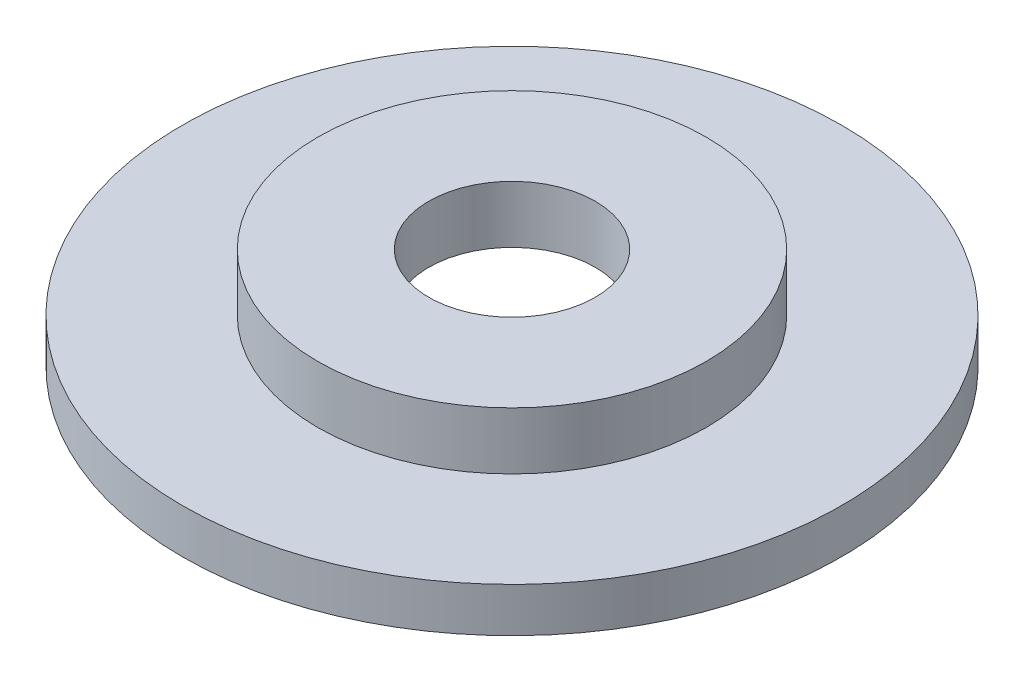
ISO-10303-21;
HEADER;
FILE_DESCRIPTION(('STEP AP214'),'2;1');
FILE_NAME('part.step','',(''),(''),'','','');
FILE_SCHEMA(('AUTOMOTIVE_DESIGN { 1 0 10303 214 1 1 1 1 }'));
ENDSEC;
DATA;
#1=APPLICATION_CONTEXT('core data for automotive mechanical design processes');
#2=APPLICATION_PROTOCOL_DEFINITION('international standard','automotive_design',2000,#1);
#3=PRODUCT_CONTEXT('',#1,'mechanical');
#4=PRODUCT('Part','Part','',(#3));
#5=PRODUCT_RELATED_PRODUCT_CATEGORY('part','',(#4));
#6=PRODUCT_DEFINITION_FORMATION('','',#4);
#7=PRODUCT_DEFINITION_CONTEXT('part definition',#1,'design');
#8=PRODUCT_DEFINITION('design','',#6,#7);
#9=PRODUCT_DEFINITION_SHAPE('','',#8);
#10=(LENGTH_UNIT() NAMED_UNIT(*) SI_UNIT(.MILLI.,.METRE.));
#11=(NAMED_UNIT(*) PLANE_ANGLE_UNIT() SI_UNIT($,.RADIAN.));
#12=(NAMED_UNIT(*) SI_UNIT($,.STERADIAN.) SOLID_ANGLE_UNIT());
#13=UNCERTAINTY_MEASURE_WITH_UNIT(LENGTH_MEASURE(1.E-05),#10,'distance_accuracy_value','');
#14=(GEOMETRIC_REPRESENTATION_CONTEXT(3) GLOBAL_UNCERTAINTY_ASSIGNED_CONTEXT((#13)) GLOBAL_UNIT_ASSIGNED_CONTEXT((#10,
#11,#12)) REPRESENTATION_CONTEXT('',''));
#15=CARTESIAN_POINT('',(0.,0.,0.));
#16=DIRECTION('',(0.,0.,1.));
#17=DIRECTION('',(1.,0.,0.));
#18=AXIS2_PLACEMENT_3D('',#15,#16,#17);
#19=CARTESIAN_POINT('',(-9.5,0.,0.));
#20=DIRECTION('',(0.,1.,0.));
#21=DIRECTION('',(0.,0.,1.));
#22=AXIS2_PLACEMENT_3D('',#19,#20,#21);
#23=PLANE('',#22);
#24=CARTESIAN_POINT('',(0.,0.,0.));
#25=DIRECTION('',(0.,-1.,0.));
#26=DIRECTION('',(0.,0.,-1.));
#27=AXIS2_PLACEMENT_3D('',#24,#25,#26);
#28=CIRCLE('',#27,4.435);
#29=CARTESIAN_POINT('',(0.,0.,-4.435));
#30=VERTEX_POINT('',#29);
#31=EDGE_CURVE('E10',#30,#30,#28,.T.);
#32=ORIENTED_EDGE('',*,*,#31,.F.);
#33=EDGE_LOOP('',(#32));
#34=FACE_BOUND('',#33,.T.);
#35=CARTESIAN_POINT('',(0.,0.,0.));
#36=DIRECTION('',(0.,-1.,0.));
#37=DIRECTION('',(0.,0.,-1.));
#38=AXIS2_PLACEMENT_3D('',#35,#36,#37);
#39=CIRCLE('',#38,9.5);
#40=CARTESIAN_POINT('',(0.,0.,-9.5));
#41=VERTEX_POINT('',#40);
#42=EDGE_CURVE('E76',#41,#41,#39,.T.);
#43=ORIENTED_EDGE('',*,*,#42,.T.);
#44=EDGE_LOOP('',(#43));
#45=FACE_BOUND('',#44,.T.);
#46=ADVANCED_FACE('F41',(#34,#45),#23,.F.);
#47=CARTESIAN_POINT('',(0.,0.,0.));
#48=DIRECTION('',(0.,-1.,0.));
#49=DIRECTION('',(0.,0.,-1.));
#50=AXIS2_PLACEMENT_3D('',#47,#48,#49);
#51=CYLINDRICAL_SURFACE('',#50,4.435);
#52=CARTESIAN_POINT('',(0.,1.28,0.));
#53=DIRECTION('',(0.,-1.,0.));
#54=DIRECTION('',(0.,0.,-1.));
#55=AXIS2_PLACEMENT_3D('',#52,#53,#54);
#56=CIRCLE('',#55,4.435);
#57=CARTESIAN_POINT('',(0.,1.28,-4.435));
#58=VERTEX_POINT('',#57);
#59=EDGE_CURVE('E48',#58,#58,#56,.T.);
#60=ORIENTED_EDGE('',*,*,#59,.F.);
#61=EDGE_LOOP('',(#60));
#62=FACE_BOUND('',#61,.T.);
#63=ORIENTED_EDGE('',*,*,#31,.T.);
#64=EDGE_LOOP('',(#63));
#65=FACE_BOUND('',#64,.T.);
#66=ADVANCED_FACE('F114',(#62,#65),#51,.F.);
#67=CARTESIAN_POINT('',(-4.435,1.28,0.));
#68=DIRECTION('',(0.,1.,0.));
#69=DIRECTION('',(0.,0.,1.));
#70=AXIS2_PLACEMENT_3D('',#67,#68,#69);
#71=PLANE('',#70);
#72=CARTESIAN_POINT('',(0.,1.28,0.));
#73=DIRECTION('',(0.,-1.,0.));
#74=DIRECTION('',(0.,0.,-1.));
#75=AXIS2_PLACEMENT_3D('',#72,#73,#74);
#76=CIRCLE('',#75,2.4);
#77=CARTESIAN_POINT('',(0.,1.28,-2.4));
#78=VERTEX_POINT('',#77);
#79=EDGE_CURVE('E54',#78,#78,#76,.T.);
#80=ORIENTED_EDGE('',*,*,#79,.F.);
#81=EDGE_LOOP('',(#80));
#82=FACE_BOUND('',#81,.T.);
#83=ORIENTED_EDGE('',*,*,#59,.T.);
#84=EDGE_LOOP('',(#83));
#85=FACE_BOUND('',#84,.T.);
#86=ADVANCED_FACE('F109',(#82,#85),#71,.F.);
#87=CARTESIAN_POINT('',(0.,0.,0.));
#88=DIRECTION('',(0.,-1.,0.));
#89=DIRECTION('',(0.,0.,-1.));
#90=AXIS2_PLACEMENT_3D('',#87,#88,#89);
#91=CYLINDRICAL_SURFACE('',#90,2.4);
#92=CARTESIAN_POINT('',(0.,2.93,0.));
#93=DIRECTION('',(0.,-1.,0.));
#94=DIRECTION('',(0.,0.,-1.));
#95=AXIS2_PLACEMENT_3D('',#92,#93,#94);
#96=CIRCLE('',#95,2.4);
#97=CARTESIAN_POINT('',(0.,2.93,-2.4));
#98=VERTEX_POINT('',#97);
#99=EDGE_CURVE('E59',#98,#98,#96,.T.);
#100=ORIENTED_EDGE('',*,*,#99,.F.);
#101=EDGE_LOOP('',(#100));
#102=FACE_BOUND('',#101,.T.);
#103=ORIENTED_EDGE('',*,*,#79,.T.);
#104=EDGE_LOOP('',(#103));
#105=FACE_BOUND('',#104,.T.);
#106=ADVANCED_FACE('F103',(#102,#105),#91,.F.);
#107=CARTESIAN_POINT('',(-2.4,2.93,0.));
#108=DIRECTION('',(0.,-1.,0.));
#109=DIRECTION('',(0.,0.,-1.));
#110=AXIS2_PLACEMENT_3D('',#107,#108,#109);
#111=PLANE('',#110);
#112=CARTESIAN_POINT('',(0.,2.93,0.));
#113=DIRECTION('',(0.,-1.,0.));
#114=DIRECTION('',(0.,0.,-1.));
#115=AXIS2_PLACEMENT_3D('',#112,#113,#114);
#116=CIRCLE('',#115,5.6);
#117=CARTESIAN_POINT('',(0.,2.93,-5.6));
#118=VERTEX_POINT('',#117);
#119=EDGE_CURVE('E65',#118,#118,#116,.T.);
#120=ORIENTED_EDGE('',*,*,#119,.F.);
#121=EDGE_LOOP('',(#120));
#122=FACE_BOUND('',#121,.T.);
#123=ORIENTED_EDGE('',*,*,#99,.T.);
#124=EDGE_LOOP('',(#123));
#125=FACE_BOUND('',#124,.T.);
#126=ADVANCED_FACE('F97',(#122,#125),#111,.F.);
#127=CARTESIAN_POINT('',(0.,0.,0.));
#128=DIRECTION('',(0.,-1.,0.));
#129=DIRECTION('',(0.,0.,-1.));
#130=AXIS2_PLACEMENT_3D('',#127,#128,#129);
#131=CYLINDRICAL_SURFACE('',#130,5.6);
#132=CARTESIAN_POINT('',(0.,1.28,0.));
#133=DIRECTION('',(0.,-1.,0.));
#134=DIRECTION('',(0.,0.,-1.));
#135=AXIS2_PLACEMENT_3D('',#132,#133,#134);
#136=CIRCLE('',#135,5.6);
#137=CARTESIAN_POINT('',(0.,1.28,-5.6));
#138=VERTEX_POINT('',#137);
#139=EDGE_CURVE('E69',#138,#138,#136,.T.);
#140=ORIENTED_EDGE('',*,*,#139,.F.);
#141=EDGE_LOOP('',(#140));
#142=FACE_BOUND('',#141,.T.);
#143=ORIENTED_EDGE('',*,*,#119,.T.);
#144=EDGE_LOOP('',(#143));
#145=FACE_BOUND('',#144,.T.);
#146=ADVANCED_FACE('F91',(#142,#145),#131,.T.);
#147=CARTESIAN_POINT('',(-5.6,1.28,0.));
#148=DIRECTION('',(0.,-1.,0.));
#149=DIRECTION('',(0.,0.,-1.));
#150=AXIS2_PLACEMENT_3D('',#147,#148,#149);
#151=PLANE('',#150);
#152=CARTESIAN_POINT('',(0.,1.28,0.));
#153=DIRECTION('',(0.,-1.,0.));
#154=DIRECTION('',(0.,0.,-1.));
#155=AXIS2_PLACEMENT_3D('',#152,#153,#154);
#156=CIRCLE('',#155,9.5);
#157=CARTESIAN_POINT('',(0.,1.28,-9.5));
#158=VERTEX_POINT('',#157);
#159=EDGE_CURVE('E72',#158,#158,#156,.T.);
#160=ORIENTED_EDGE('',*,*,#159,.F.);
#161=EDGE_LOOP('',(#160));
#162=FACE_BOUND('',#161,.T.);
#163=ORIENTED_EDGE('',*,*,#139,.T.);
#164=EDGE_LOOP('',(#163));
#165=FACE_BOUND('',#164,.T.);
#166=ADVANCED_FACE('F85',(#162,#165),#151,.F.);
#167=CARTESIAN_POINT('',(0.,0.,0.));
#168=DIRECTION('',(0.,-1.,0.));
#169=DIRECTION('',(0.,0.,-1.));
#170=AXIS2_PLACEMENT_3D('',#167,#168,#169);
#171=CYLINDRICAL_SURFACE('',#170,9.5);
#172=ORIENTED_EDGE('',*,*,#42,.F.);
#173=EDGE_LOOP('',(#172));
#174=FACE_BOUND('',#173,.T.);
#175=ORIENTED_EDGE('',*,*,#159,.T.);
#176=EDGE_LOOP('',(#175));
#177=FACE_BOUND('',#176,.T.);
#178=ADVANCED_FACE('F82',(#174,#177),#171,.T.);
#179=CLOSED_SHELL('',(#46,#66,#86,#106,#126,#146,#166,#178));
#180=MANIFOLD_SOLID_BREP('B2',#179);
#181=ADVANCED_BREP_SHAPE_REPRESENTATION('',(#18,#180),#14);
#182=SHAPE_DEFINITION_REPRESENTATION(#9,#181);
ENDSEC;
END-ISO-10303-21;
